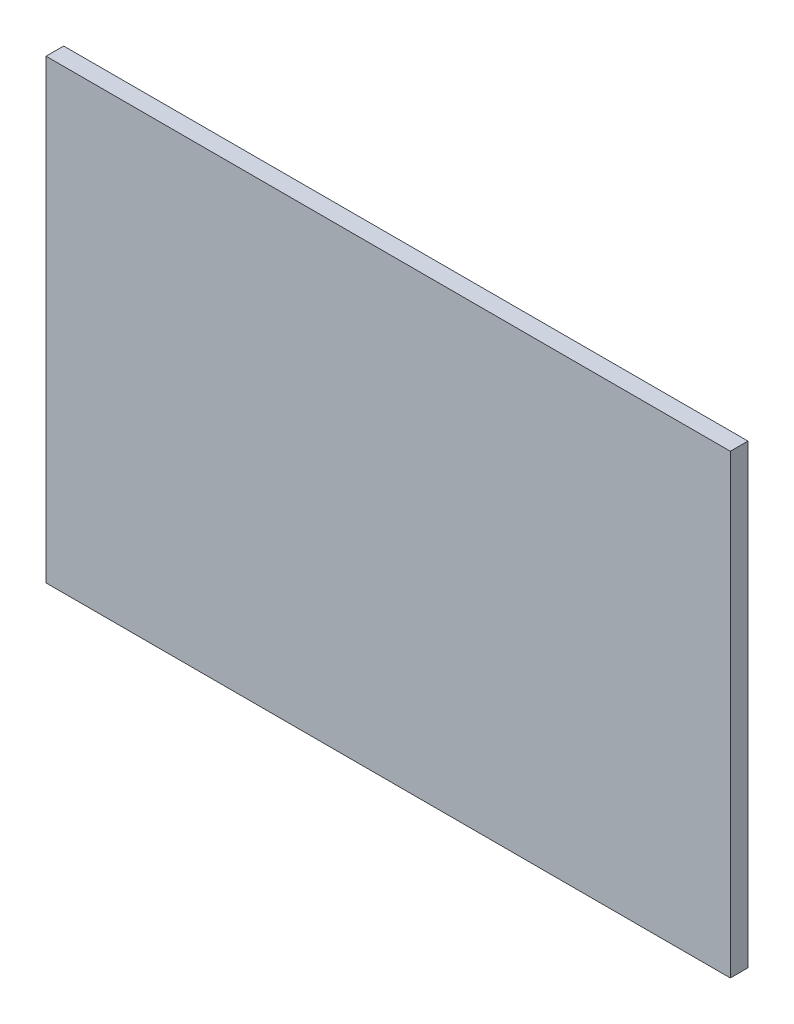
ISO-10303-21;
HEADER;
FILE_DESCRIPTION(('STEP AP214'),'2;1');
FILE_NAME('part.step','',(''),(''),'','','');
FILE_SCHEMA(('AUTOMOTIVE_DESIGN { 1 0 10303 214 1 1 1 1 }'));
ENDSEC;
DATA;
#1=APPLICATION_CONTEXT('core data for automotive mechanical design processes');
#2=APPLICATION_PROTOCOL_DEFINITION('international standard','automotive_design',2000,#1);
#3=PRODUCT_CONTEXT('',#1,'mechanical');
#4=PRODUCT('Part','Part','',(#3));
#5=PRODUCT_RELATED_PRODUCT_CATEGORY('part','',(#4));
#6=PRODUCT_DEFINITION_FORMATION('','',#4);
#7=PRODUCT_DEFINITION_CONTEXT('part definition',#1,'design');
#8=PRODUCT_DEFINITION('design','',#6,#7);
#9=PRODUCT_DEFINITION_SHAPE('','',#8);
#10=(LENGTH_UNIT() NAMED_UNIT(*) SI_UNIT(.MILLI.,.METRE.));
#11=(NAMED_UNIT(*) PLANE_ANGLE_UNIT() SI_UNIT($,.RADIAN.));
#12=(NAMED_UNIT(*) SI_UNIT($,.STERADIAN.) SOLID_ANGLE_UNIT());
#13=UNCERTAINTY_MEASURE_WITH_UNIT(LENGTH_MEASURE(1.E-05),#10,'distance_accuracy_value','');
#14=(GEOMETRIC_REPRESENTATION_CONTEXT(3) GLOBAL_UNCERTAINTY_ASSIGNED_CONTEXT((#13)) GLOBAL_UNIT_ASSIGNED_CONTEXT((#10,
#11,#12)) REPRESENTATION_CONTEXT('',''));
#15=CARTESIAN_POINT('',(0.,0.,0.));
#16=DIRECTION('',(0.,0.,1.));
#17=DIRECTION('',(1.,0.,0.));
#18=AXIS2_PLACEMENT_3D('',#15,#16,#17);
#19=CARTESIAN_POINT('',(-45.,-30.,2.32));
#20=DIRECTION('',(1.,0.,0.));
#21=DIRECTION('',(0.,0.,-1.));
#22=AXIS2_PLACEMENT_3D('',#19,#20,#21);
#23=PLANE('',#22);
#24=DIRECTION('',(0.,-1.,0.));
#25=VECTOR('',#24,1.);
#26=CARTESIAN_POINT('',(-45.,-30.,0.));
#27=LINE('',#26,#25);
#28=CARTESIAN_POINT('',(-45.,30.,0.));
#29=VERTEX_POINT('',#28);
#30=CARTESIAN_POINT('',(-45.,-30.,0.));
#31=VERTEX_POINT('',#30);
#32=EDGE_CURVE('E102',#29,#31,#27,.T.);
#33=ORIENTED_EDGE('',*,*,#32,.T.);
#34=DIRECTION('',(0.,0.,-1.));
#35=VECTOR('',#34,1.);
#36=CARTESIAN_POINT('',(-45.,-30.,2.32));
#37=LINE('',#36,#35);
#38=CARTESIAN_POINT('',(-45.,-30.,2.32));
#39=VERTEX_POINT('',#38);
#40=EDGE_CURVE('E11',#39,#31,#37,.T.);
#41=ORIENTED_EDGE('',*,*,#40,.F.);
#42=DIRECTION('',(0.,-1.,0.));
#43=VECTOR('',#42,1.);
#44=CARTESIAN_POINT('',(-45.,-30.,2.32));
#45=LINE('',#44,#43);
#46=CARTESIAN_POINT('',(-45.,30.,2.32));
#47=VERTEX_POINT('',#46);
#48=EDGE_CURVE('E90',#47,#39,#45,.T.);
#49=ORIENTED_EDGE('',*,*,#48,.F.);
#50=DIRECTION('',(0.,0.,-1.));
#51=VECTOR('',#50,1.);
#52=CARTESIAN_POINT('',(-45.,30.,2.32));
#53=LINE('',#52,#51);
#54=EDGE_CURVE('E98',#47,#29,#53,.T.);
#55=ORIENTED_EDGE('',*,*,#54,.T.);
#56=EDGE_LOOP('',(#33,#41,#49,#55));
#57=FACE_BOUND('',#56,.T.);
#58=ADVANCED_FACE('F39',(#57),#23,.F.);
#59=CARTESIAN_POINT('',(45.,-30.,2.32));
#60=DIRECTION('',(0.,1.,0.));
#61=DIRECTION('',(-1.,0.,0.));
#62=AXIS2_PLACEMENT_3D('',#59,#60,#61);
#63=PLANE('',#62);
#64=DIRECTION('',(1.,0.,0.));
#65=VECTOR('',#64,1.);
#66=CARTESIAN_POINT('',(45.,-30.,0.));
#67=LINE('',#66,#65);
#68=CARTESIAN_POINT('',(45.,-30.,0.));
#69=VERTEX_POINT('',#68);
#70=EDGE_CURVE('E94',#31,#69,#67,.T.);
#71=ORIENTED_EDGE('',*,*,#70,.T.);
#72=DIRECTION('',(0.,0.,-1.));
#73=VECTOR('',#72,1.);
#74=CARTESIAN_POINT('',(45.,-30.,2.32));
#75=LINE('',#74,#73);
#76=CARTESIAN_POINT('',(45.,-30.,2.32));
#77=VERTEX_POINT('',#76);
#78=EDGE_CURVE('E47',#77,#69,#75,.T.);
#79=ORIENTED_EDGE('',*,*,#78,.F.);
#80=DIRECTION('',(1.,0.,0.));
#81=VECTOR('',#80,1.);
#82=CARTESIAN_POINT('',(45.,-30.,2.32));
#83=LINE('',#82,#81);
#84=EDGE_CURVE('E85',#39,#77,#83,.T.);
#85=ORIENTED_EDGE('',*,*,#84,.F.);
#86=ORIENTED_EDGE('',*,*,#40,.T.);
#87=EDGE_LOOP('',(#71,#79,#85,#86));
#88=FACE_BOUND('',#87,.T.);
#89=ADVANCED_FACE('F93',(#88),#63,.F.);
#90=CARTESIAN_POINT('',(45.,-30.,2.32));
#91=DIRECTION('',(-1.,0.,0.));
#92=DIRECTION('',(0.,0.,1.));
#93=AXIS2_PLACEMENT_3D('',#90,#91,#92);
#94=PLANE('',#93);
#95=DIRECTION('',(0.,1.,0.));
#96=VECTOR('',#95,1.);
#97=CARTESIAN_POINT('',(45.,-30.,0.));
#98=LINE('',#97,#96);
#99=CARTESIAN_POINT('',(45.,30.,0.));
#100=VERTEX_POINT('',#99);
#101=EDGE_CURVE('E72',#69,#100,#98,.T.);
#102=ORIENTED_EDGE('',*,*,#101,.T.);
#103=DIRECTION('',(0.,0.,-1.));
#104=VECTOR('',#103,1.);
#105=CARTESIAN_POINT('',(45.,30.,2.32));
#106=LINE('',#105,#104);
#107=CARTESIAN_POINT('',(45.,30.,2.32));
#108=VERTEX_POINT('',#107);
#109=EDGE_CURVE('E95',#108,#100,#106,.T.);
#110=ORIENTED_EDGE('',*,*,#109,.F.);
#111=DIRECTION('',(0.,1.,0.));
#112=VECTOR('',#111,1.);
#113=CARTESIAN_POINT('',(45.,-30.,2.32));
#114=LINE('',#113,#112);
#115=EDGE_CURVE('E88',#77,#108,#114,.T.);
#116=ORIENTED_EDGE('',*,*,#115,.F.);
#117=ORIENTED_EDGE('',*,*,#78,.T.);
#118=EDGE_LOOP('',(#102,#110,#116,#117));
#119=FACE_BOUND('',#118,.T.);
#120=ADVANCED_FACE('F96',(#119),#94,.F.);
#121=CARTESIAN_POINT('',(45.,30.,2.32));
#122=DIRECTION('',(0.,-1.,0.));
#123=DIRECTION('',(1.,0.,0.));
#124=AXIS2_PLACEMENT_3D('',#121,#122,#123);
#125=PLANE('',#124);
#126=DIRECTION('',(-1.,0.,0.));
#127=VECTOR('',#126,1.);
#128=CARTESIAN_POINT('',(45.,30.,0.));
#129=LINE('',#128,#127);
#130=EDGE_CURVE('E78',#100,#29,#129,.T.);
#131=ORIENTED_EDGE('',*,*,#130,.T.);
#132=ORIENTED_EDGE('',*,*,#54,.F.);
#133=DIRECTION('',(-1.,0.,0.));
#134=VECTOR('',#133,1.);
#135=CARTESIAN_POINT('',(45.,30.,2.32));
#136=LINE('',#135,#134);
#137=EDGE_CURVE('E55',#108,#47,#136,.T.);
#138=ORIENTED_EDGE('',*,*,#137,.F.);
#139=ORIENTED_EDGE('',*,*,#109,.T.);
#140=EDGE_LOOP('',(#131,#132,#138,#139));
#141=FACE_BOUND('',#140,.T.);
#142=ADVANCED_FACE('F109',(#141),#125,.F.);
#143=CARTESIAN_POINT('',(0.,0.,2.32));
#144=DIRECTION('',(0.,0.,1.));
#145=DIRECTION('',(1.,0.,0.));
#146=AXIS2_PLACEMENT_3D('',#143,#144,#145);
#147=PLANE('',#146);
#148=ORIENTED_EDGE('',*,*,#48,.T.);
#149=ORIENTED_EDGE('',*,*,#84,.T.);
#150=ORIENTED_EDGE('',*,*,#115,.T.);
#151=ORIENTED_EDGE('',*,*,#137,.T.);
#152=EDGE_LOOP('',(#148,#149,#150,#151));
#153=FACE_BOUND('',#152,.T.);
#154=ADVANCED_FACE('F86',(#153),#147,.T.);
#155=CARTESIAN_POINT('',(0.,0.,0.));
#156=DIRECTION('',(0.,0.,1.));
#157=DIRECTION('',(1.,0.,0.));
#158=AXIS2_PLACEMENT_3D('',#155,#156,#157);
#159=PLANE('',#158);
#160=ORIENTED_EDGE('',*,*,#32,.F.);
#161=ORIENTED_EDGE('',*,*,#130,.F.);
#162=ORIENTED_EDGE('',*,*,#101,.F.);
#163=ORIENTED_EDGE('',*,*,#70,.F.);
#164=EDGE_LOOP('',(#160,#161,#162,#163));
#165=FACE_BOUND('',#164,.T.);
#166=ADVANCED_FACE('F112',(#165),#159,.F.);
#167=CLOSED_SHELL('',(#58,#89,#120,#142,#154,#166));
#168=MANIFOLD_SOLID_BREP('B2',#167);
#169=ADVANCED_BREP_SHAPE_REPRESENTATION('',(#18,#168),#14);
#170=SHAPE_DEFINITION_REPRESENTATION(#9,#169);
ENDSEC;
END-ISO-10303-21;
